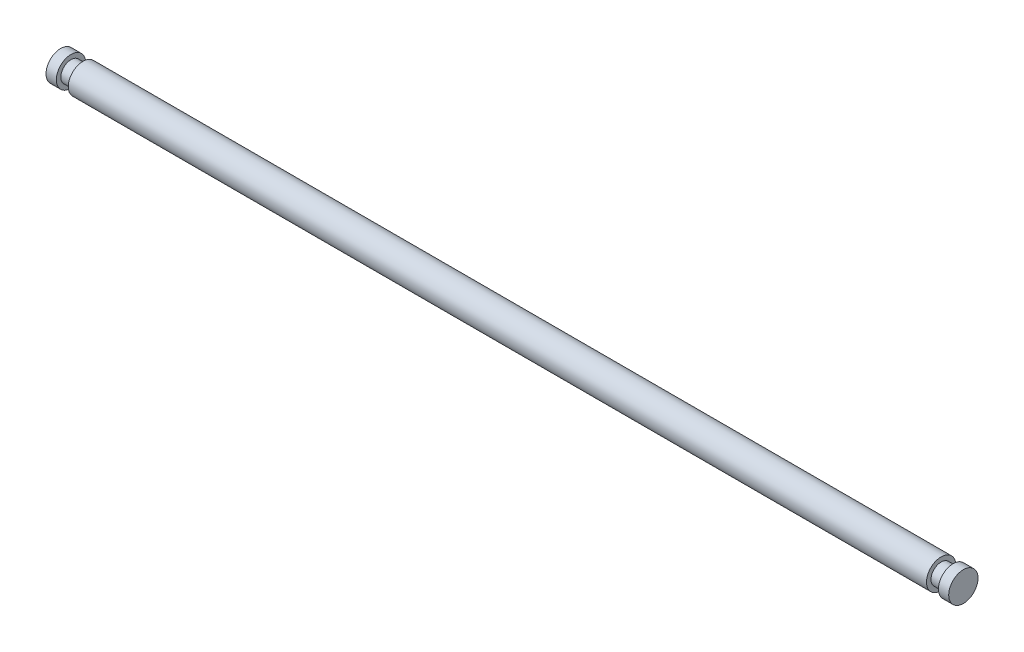
ISO-10303-21;
HEADER;
FILE_DESCRIPTION(('STEP AP214'),'2;1');
FILE_NAME('part.step','',(''),(''),'','','');
FILE_SCHEMA(('AUTOMOTIVE_DESIGN { 1 0 10303 214 1 1 1 1 }'));
ENDSEC;
DATA;
#1=APPLICATION_CONTEXT('core data for automotive mechanical design processes');
#2=APPLICATION_PROTOCOL_DEFINITION('international standard','automotive_design',2000,#1);
#3=PRODUCT_CONTEXT('',#1,'mechanical');
#4=PRODUCT('Part','Part','',(#3));
#5=PRODUCT_RELATED_PRODUCT_CATEGORY('part','',(#4));
#6=PRODUCT_DEFINITION_FORMATION('','',#4);
#7=PRODUCT_DEFINITION_CONTEXT('part definition',#1,'design');
#8=PRODUCT_DEFINITION('design','',#6,#7);
#9=PRODUCT_DEFINITION_SHAPE('','',#8);
#10=(LENGTH_UNIT() NAMED_UNIT(*) SI_UNIT(.MILLI.,.METRE.));
#11=(NAMED_UNIT(*) PLANE_ANGLE_UNIT() SI_UNIT($,.RADIAN.));
#12=(NAMED_UNIT(*) SI_UNIT($,.STERADIAN.) SOLID_ANGLE_UNIT());
#13=UNCERTAINTY_MEASURE_WITH_UNIT(LENGTH_MEASURE(1.E-05),#10,'distance_accuracy_value','');
#14=(GEOMETRIC_REPRESENTATION_CONTEXT(3) GLOBAL_UNCERTAINTY_ASSIGNED_CONTEXT((#13)) GLOBAL_UNIT_ASSIGNED_CONTEXT((#10,
#11,#12)) REPRESENTATION_CONTEXT('',''));
#15=CARTESIAN_POINT('',(0.,0.,0.));
#16=DIRECTION('',(0.,0.,1.));
#17=DIRECTION('',(1.,0.,0.));
#18=AXIS2_PLACEMENT_3D('',#15,#16,#17);
#19=CARTESIAN_POINT('',(0.,0.,0.));
#20=DIRECTION('',(1.,0.,0.));
#21=DIRECTION('',(0.,0.,-1.));
#22=AXIS2_PLACEMENT_3D('',#19,#20,#21);
#23=PLANE('',#22);
#24=CARTESIAN_POINT('',(0.,0.,0.));
#25=DIRECTION('',(-1.,0.,0.));
#26=DIRECTION('',(0.,0.,1.));
#27=AXIS2_PLACEMENT_3D('',#24,#25,#26);
#28=CIRCLE('',#27,31.73095);
#29=CARTESIAN_POINT('',(0.,0.,31.73095));
#30=VERTEX_POINT('',#29);
#31=EDGE_CURVE('E10',#30,#30,#28,.T.);
#32=ORIENTED_EDGE('',*,*,#31,.T.);
#33=EDGE_LOOP('',(#32));
#34=FACE_BOUND('',#33,.T.);
#35=ADVANCED_FACE('F41',(#34),#23,.F.);
#36=CARTESIAN_POINT('',(-25.4,0.,0.));
#37=DIRECTION('',(-1.,0.,0.));
#38=DIRECTION('',(0.,0.,1.));
#39=AXIS2_PLACEMENT_3D('',#36,#37,#38);
#40=CYLINDRICAL_SURFACE('',#39,31.73095);
#41=ORIENTED_EDGE('',*,*,#31,.F.);
#42=EDGE_LOOP('',(#41));
#43=FACE_BOUND('',#42,.T.);
#44=CARTESIAN_POINT('',(22.352,0.,0.));
#45=DIRECTION('',(-1.,0.,0.));
#46=DIRECTION('',(0.,0.,1.));
#47=AXIS2_PLACEMENT_3D('',#44,#45,#46);
#48=CIRCLE('',#47,31.73095);
#49=CARTESIAN_POINT('',(22.352,0.,31.73095));
#50=VERTEX_POINT('',#49);
#51=EDGE_CURVE('E47',#50,#50,#48,.T.);
#52=ORIENTED_EDGE('',*,*,#51,.T.);
#53=EDGE_LOOP('',(#52));
#54=FACE_BOUND('',#53,.T.);
#55=ADVANCED_FACE('F91',(#43,#54),#40,.T.);
#56=CARTESIAN_POINT('',(22.352,31.73095,0.));
#57=DIRECTION('',(-1.,0.,0.));
#58=DIRECTION('',(0.,0.,1.));
#59=AXIS2_PLACEMENT_3D('',#56,#57,#58);
#60=PLANE('',#59);
#61=ORIENTED_EDGE('',*,*,#51,.F.);
#62=EDGE_LOOP('',(#61));
#63=FACE_BOUND('',#62,.T.);
#64=CARTESIAN_POINT('',(22.352,0.,0.));
#65=DIRECTION('',(-1.,0.,0.));
#66=DIRECTION('',(0.,0.,1.));
#67=AXIS2_PLACEMENT_3D('',#64,#65,#66);
#68=CIRCLE('',#67,22.0218);
#69=CARTESIAN_POINT('',(22.352,0.,22.0218));
#70=VERTEX_POINT('',#69);
#71=EDGE_CURVE('E51',#70,#70,#68,.T.);
#72=ORIENTED_EDGE('',*,*,#71,.T.);
#73=EDGE_LOOP('',(#72));
#74=FACE_BOUND('',#73,.T.);
#75=ADVANCED_FACE('F95',(#63,#74),#60,.F.);
#76=CARTESIAN_POINT('',(-25.4,0.,0.));
#77=DIRECTION('',(-1.,0.,0.));
#78=DIRECTION('',(0.,0.,1.));
#79=AXIS2_PLACEMENT_3D('',#76,#77,#78);
#80=CYLINDRICAL_SURFACE('',#79,22.0218);
#81=ORIENTED_EDGE('',*,*,#71,.F.);
#82=EDGE_LOOP('',(#81));
#83=FACE_BOUND('',#82,.T.);
#84=CARTESIAN_POINT('',(48.1584,0.,0.));
#85=DIRECTION('',(-1.,0.,0.));
#86=DIRECTION('',(0.,0.,1.));
#87=AXIS2_PLACEMENT_3D('',#84,#85,#86);
#88=CIRCLE('',#87,22.0218);
#89=CARTESIAN_POINT('',(48.1584,0.,22.0218));
#90=VERTEX_POINT('',#89);
#91=EDGE_CURVE('E55',#90,#90,#88,.T.);
#92=ORIENTED_EDGE('',*,*,#91,.T.);
#93=EDGE_LOOP('',(#92));
#94=FACE_BOUND('',#93,.T.);
#95=ADVANCED_FACE('F100',(#83,#94),#80,.T.);
#96=CARTESIAN_POINT('',(48.1584,22.0218,0.));
#97=DIRECTION('',(1.,0.,0.));
#98=DIRECTION('',(0.,0.,-1.));
#99=AXIS2_PLACEMENT_3D('',#96,#97,#98);
#100=PLANE('',#99);
#101=ORIENTED_EDGE('',*,*,#91,.F.);
#102=EDGE_LOOP('',(#101));
#103=FACE_BOUND('',#102,.T.);
#104=CARTESIAN_POINT('',(48.1584,0.,0.));
#105=DIRECTION('',(-1.,0.,0.));
#106=DIRECTION('',(0.,0.,1.));
#107=AXIS2_PLACEMENT_3D('',#104,#105,#106);
#108=CIRCLE('',#107,31.73095);
#109=CARTESIAN_POINT('',(48.1584,0.,31.73095));
#110=VERTEX_POINT('',#109);
#111=EDGE_CURVE('E60',#110,#110,#108,.T.);
#112=ORIENTED_EDGE('',*,*,#111,.T.);
#113=EDGE_LOOP('',(#112));
#114=FACE_BOUND('',#113,.T.);
#115=ADVANCED_FACE('F106',(#103,#114),#100,.F.);
#116=CARTESIAN_POINT('',(-25.4,0.,0.));
#117=DIRECTION('',(-1.,0.,0.));
#118=DIRECTION('',(0.,0.,1.));
#119=AXIS2_PLACEMENT_3D('',#116,#117,#118);
#120=CYLINDRICAL_SURFACE('',#119,31.73095);
#121=ORIENTED_EDGE('',*,*,#111,.F.);
#122=EDGE_LOOP('',(#121));
#123=FACE_BOUND('',#122,.T.);
#124=CARTESIAN_POINT('',(1904.7206,0.,0.));
#125=DIRECTION('',(-1.,0.,0.));
#126=DIRECTION('',(0.,0.,1.));
#127=AXIS2_PLACEMENT_3D('',#124,#125,#126);
#128=CIRCLE('',#127,31.73095);
#129=CARTESIAN_POINT('',(1904.7206,0.,31.73095));
#130=VERTEX_POINT('',#129);
#131=EDGE_CURVE('E63',#130,#130,#128,.T.);
#132=ORIENTED_EDGE('',*,*,#131,.T.);
#133=EDGE_LOOP('',(#132));
#134=FACE_BOUND('',#133,.T.);
#135=ADVANCED_FACE('F110',(#123,#134),#120,.T.);
#136=CARTESIAN_POINT('',(1904.7206,31.73095,0.));
#137=DIRECTION('',(-1.,0.,0.));
#138=DIRECTION('',(0.,0.,1.));
#139=AXIS2_PLACEMENT_3D('',#136,#137,#138);
#140=PLANE('',#139);
#141=ORIENTED_EDGE('',*,*,#131,.F.);
#142=EDGE_LOOP('',(#141));
#143=FACE_BOUND('',#142,.T.);
#144=CARTESIAN_POINT('',(1904.7206,0.,0.));
#145=DIRECTION('',(-1.,0.,0.));
#146=DIRECTION('',(0.,0.,1.));
#147=AXIS2_PLACEMENT_3D('',#144,#145,#146);
#148=CIRCLE('',#147,22.0218);
#149=CARTESIAN_POINT('',(1904.7206,0.,22.0218));
#150=VERTEX_POINT('',#149);
#151=EDGE_CURVE('E66',#150,#150,#148,.T.);
#152=ORIENTED_EDGE('',*,*,#151,.T.);
#153=EDGE_LOOP('',(#152));
#154=FACE_BOUND('',#153,.T.);
#155=ADVANCED_FACE('F114',(#143,#154),#140,.F.);
#156=CARTESIAN_POINT('',(-25.4,0.,0.));
#157=DIRECTION('',(-1.,0.,0.));
#158=DIRECTION('',(0.,0.,1.));
#159=AXIS2_PLACEMENT_3D('',#156,#157,#158);
#160=CYLINDRICAL_SURFACE('',#159,22.0218);
#161=ORIENTED_EDGE('',*,*,#151,.F.);
#162=EDGE_LOOP('',(#161));
#163=FACE_BOUND('',#162,.T.);
#164=CARTESIAN_POINT('',(1930.527,0.,0.));
#165=DIRECTION('',(-1.,0.,0.));
#166=DIRECTION('',(0.,0.,1.));
#167=AXIS2_PLACEMENT_3D('',#164,#165,#166);
#168=CIRCLE('',#167,22.0218);
#169=CARTESIAN_POINT('',(1930.527,0.,22.0218));
#170=VERTEX_POINT('',#169);
#171=EDGE_CURVE('E69',#170,#170,#168,.T.);
#172=ORIENTED_EDGE('',*,*,#171,.T.);
#173=EDGE_LOOP('',(#172));
#174=FACE_BOUND('',#173,.T.);
#175=ADVANCED_FACE('F118',(#163,#174),#160,.T.);
#176=CARTESIAN_POINT('',(1930.527,22.0218,0.));
#177=DIRECTION('',(1.,0.,0.));
#178=DIRECTION('',(0.,0.,-1.));
#179=AXIS2_PLACEMENT_3D('',#176,#177,#178);
#180=PLANE('',#179);
#181=ORIENTED_EDGE('',*,*,#171,.F.);
#182=EDGE_LOOP('',(#181));
#183=FACE_BOUND('',#182,.T.);
#184=CARTESIAN_POINT('',(1930.527,0.,0.));
#185=DIRECTION('',(-1.,0.,0.));
#186=DIRECTION('',(0.,0.,1.));
#187=AXIS2_PLACEMENT_3D('',#184,#185,#186);
#188=CIRCLE('',#187,31.73095);
#189=CARTESIAN_POINT('',(1930.527,0.,31.73095));
#190=VERTEX_POINT('',#189);
#191=EDGE_CURVE('E72',#190,#190,#188,.T.);
#192=ORIENTED_EDGE('',*,*,#191,.T.);
#193=EDGE_LOOP('',(#192));
#194=FACE_BOUND('',#193,.T.);
#195=ADVANCED_FACE('F87',(#183,#194),#180,.F.);
#196=CARTESIAN_POINT('',(-25.4,0.,0.));
#197=DIRECTION('',(-1.,0.,0.));
#198=DIRECTION('',(0.,0.,1.));
#199=AXIS2_PLACEMENT_3D('',#196,#197,#198);
#200=CYLINDRICAL_SURFACE('',#199,31.73095);
#201=ORIENTED_EDGE('',*,*,#191,.F.);
#202=EDGE_LOOP('',(#201));
#203=FACE_BOUND('',#202,.T.);
#204=CARTESIAN_POINT('',(1952.752,0.,0.));
#205=DIRECTION('',(-1.,0.,0.));
#206=DIRECTION('',(0.,0.,1.));
#207=AXIS2_PLACEMENT_3D('',#204,#205,#206);
#208=CIRCLE('',#207,31.73095);
#209=CARTESIAN_POINT('',(1952.752,0.,31.73095));
#210=VERTEX_POINT('',#209);
#211=EDGE_CURVE('E75',#210,#210,#208,.T.);
#212=ORIENTED_EDGE('',*,*,#211,.T.);
#213=EDGE_LOOP('',(#212));
#214=FACE_BOUND('',#213,.T.);
#215=ADVANCED_FACE('F79',(#203,#214),#200,.T.);
#216=CARTESIAN_POINT('',(1952.752,31.73095,0.));
#217=DIRECTION('',(-1.,0.,0.));
#218=DIRECTION('',(0.,0.,1.));
#219=AXIS2_PLACEMENT_3D('',#216,#217,#218);
#220=PLANE('',#219);
#221=ORIENTED_EDGE('',*,*,#211,.F.);
#222=EDGE_LOOP('',(#221));
#223=FACE_BOUND('',#222,.T.);
#224=ADVANCED_FACE('F81',(#223),#220,.F.);
#225=CLOSED_SHELL('',(#35,#55,#75,#95,#115,#135,#155,#175,#195,#215,#224));
#226=MANIFOLD_SOLID_BREP('B2',#225);
#227=ADVANCED_BREP_SHAPE_REPRESENTATION('',(#18,#226),#14);
#228=SHAPE_DEFINITION_REPRESENTATION(#9,#227);
ENDSEC;
END-ISO-10303-21;
